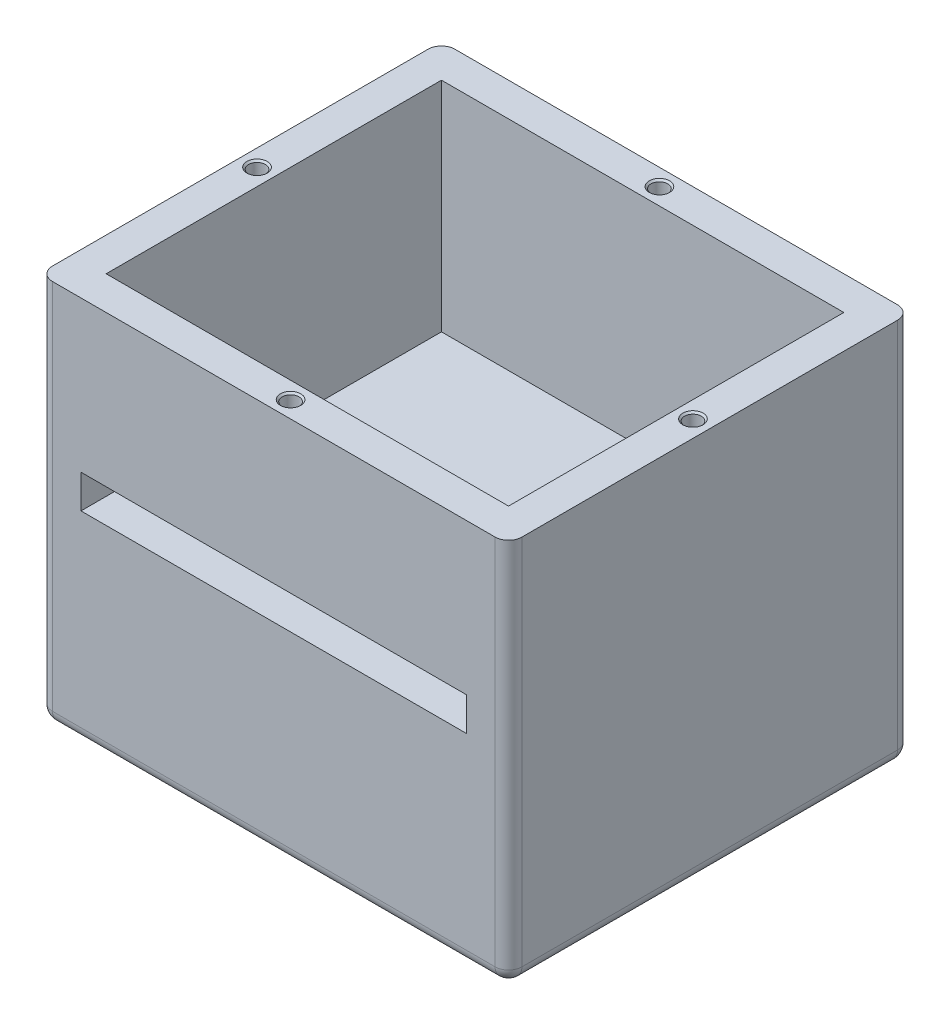
ISO-10303-21;
HEADER;
FILE_DESCRIPTION(('STEP AP214'),'2;1');
FILE_NAME('part.step','',(''),(''),'','','');
FILE_SCHEMA(('AUTOMOTIVE_DESIGN { 1 0 10303 214 1 1 1 1 }'));
ENDSEC;
DATA;
#1=APPLICATION_CONTEXT('core data for automotive mechanical design processes');
#2=APPLICATION_PROTOCOL_DEFINITION('international standard','automotive_design',2000,#1);
#3=PRODUCT_CONTEXT('',#1,'mechanical');
#4=PRODUCT('Part','Part','',(#3));
#5=PRODUCT_RELATED_PRODUCT_CATEGORY('part','',(#4));
#6=PRODUCT_DEFINITION_FORMATION('','',#4);
#7=PRODUCT_DEFINITION_CONTEXT('part definition',#1,'design');
#8=PRODUCT_DEFINITION('design','',#6,#7);
#9=PRODUCT_DEFINITION_SHAPE('','',#8);
#10=(LENGTH_UNIT() NAMED_UNIT(*) SI_UNIT(.MILLI.,.METRE.));
#11=(NAMED_UNIT(*) PLANE_ANGLE_UNIT() SI_UNIT($,.RADIAN.));
#12=(NAMED_UNIT(*) SI_UNIT($,.STERADIAN.) SOLID_ANGLE_UNIT());
#13=UNCERTAINTY_MEASURE_WITH_UNIT(LENGTH_MEASURE(1.E-05),#10,'distance_accuracy_value','');
#14=(GEOMETRIC_REPRESENTATION_CONTEXT(3) GLOBAL_UNCERTAINTY_ASSIGNED_CONTEXT((#13)) GLOBAL_UNIT_ASSIGNED_CONTEXT((#10,
#11,#12)) REPRESENTATION_CONTEXT('',''));
#15=CARTESIAN_POINT('',(0.,0.,0.));
#16=DIRECTION('',(0.,0.,1.));
#17=DIRECTION('',(1.,0.,0.));
#18=AXIS2_PLACEMENT_3D('',#15,#16,#17);
#19=CARTESIAN_POINT('',(0.,45.,0.));
#20=DIRECTION('',(0.,1.,0.));
#21=DIRECTION('',(0.,0.,1.));
#22=AXIS2_PLACEMENT_3D('',#19,#20,#21);
#23=PLANE('',#22);
#24=CARTESIAN_POINT('',(-15.,45.,0.));
#25=DIRECTION('',(0.,1.,0.));
#26=DIRECTION('',(0.,0.,1.));
#27=AXIS2_PLACEMENT_3D('',#24,#25,#26);
#28=CIRCLE('',#27,14.);
#29=CARTESIAN_POINT('',(-15.,45.,14.));
#30=VERTEX_POINT('',#29);
#31=EDGE_CURVE('E226',#30,#30,#28,.T.);
#32=ORIENTED_EDGE('',*,*,#31,.F.);
#33=EDGE_LOOP('',(#32));
#34=FACE_BOUND('',#33,.T.);
#35=CARTESIAN_POINT('',(15.,45.,0.));
#36=DIRECTION('',(0.,1.,0.));
#37=DIRECTION('',(0.,0.,-1.));
#38=AXIS2_PLACEMENT_3D('',#35,#36,#37);
#39=CIRCLE('',#38,14.);
#40=CARTESIAN_POINT('',(15.,45.,-14.));
#41=VERTEX_POINT('',#40);
#42=EDGE_CURVE('E232',#41,#41,#39,.T.);
#43=ORIENTED_EDGE('',*,*,#42,.F.);
#44=EDGE_LOOP('',(#43));
#45=FACE_BOUND('',#44,.T.);
#46=DIRECTION('',(0.,0.,1.));
#47=VECTOR('',#46,1.);
#48=CARTESIAN_POINT('',(-60.,45.,-50.));
#49=LINE('',#48,#47);
#50=CARTESIAN_POINT('',(-60.,45.,-50.));
#51=VERTEX_POINT('',#50);
#52=CARTESIAN_POINT('',(-60.,45.,50.));
#53=VERTEX_POINT('',#52);
#54=EDGE_CURVE('E275',#51,#53,#49,.T.);
#55=ORIENTED_EDGE('',*,*,#54,.T.);
#56=DIRECTION('',(1.,0.,0.));
#57=VECTOR('',#56,1.);
#58=CARTESIAN_POINT('',(-60.,45.,50.));
#59=LINE('',#58,#57);
#60=CARTESIAN_POINT('',(60.,45.,50.));
#61=VERTEX_POINT('',#60);
#62=EDGE_CURVE('E278',#53,#61,#59,.T.);
#63=ORIENTED_EDGE('',*,*,#62,.T.);
#64=DIRECTION('',(0.,0.,-1.));
#65=VECTOR('',#64,1.);
#66=CARTESIAN_POINT('',(60.,45.,-50.));
#67=LINE('',#66,#65);
#68=CARTESIAN_POINT('',(60.,45.,-50.));
#69=VERTEX_POINT('',#68);
#70=EDGE_CURVE('E282',#61,#69,#67,.T.);
#71=ORIENTED_EDGE('',*,*,#70,.T.);
#72=DIRECTION('',(-1.,0.,0.));
#73=VECTOR('',#72,1.);
#74=CARTESIAN_POINT('',(-60.,45.,-50.));
#75=LINE('',#74,#73);
#76=EDGE_CURVE('E285',#69,#51,#75,.T.);
#77=ORIENTED_EDGE('',*,*,#76,.T.);
#78=EDGE_LOOP('',(#55,#63,#71,#77));
#79=FACE_BOUND('',#78,.T.);
#80=ADVANCED_FACE('F39',(#34,#45,#79),#23,.T.);
#81=CARTESIAN_POINT('',(-70.,-5.,60.));
#82=DIRECTION('',(-1.,0.,0.));
#83=DIRECTION('',(0.,0.,1.));
#84=AXIS2_PLACEMENT_3D('',#81,#82,#83);
#85=PLANE('',#84);
#86=DIRECTION('',(0.,0.,1.));
#87=VECTOR('',#86,1.);
#88=CARTESIAN_POINT('',(-70.,110.,60.));
#89=LINE('',#88,#87);
#90=CARTESIAN_POINT('',(-70.,110.,-56.));
#91=VERTEX_POINT('',#90);
#92=CARTESIAN_POINT('',(-70.,110.,56.));
#93=VERTEX_POINT('',#92);
#94=EDGE_CURVE('E300',#91,#93,#89,.T.);
#95=ORIENTED_EDGE('',*,*,#94,.F.);
#96=DIRECTION('',(0.,1.,0.));
#97=VECTOR('',#96,1.);
#98=CARTESIAN_POINT('',(-70.,-5.,-56.));
#99=LINE('',#98,#97);
#100=CARTESIAN_POINT('',(-70.,-1.,-56.));
#101=VERTEX_POINT('',#100);
#102=EDGE_CURVE('E329',#91,#101,#99,.F.);
#103=ORIENTED_EDGE('',*,*,#102,.T.);
#104=DIRECTION('',(0.,0.,1.));
#105=VECTOR('',#104,1.);
#106=CARTESIAN_POINT('',(-70.,-1.,60.));
#107=LINE('',#106,#105);
#108=CARTESIAN_POINT('',(-70.,-1.,56.));
#109=VERTEX_POINT('',#108);
#110=EDGE_CURVE('E326',#101,#109,#107,.T.);
#111=ORIENTED_EDGE('',*,*,#110,.T.);
#112=DIRECTION('',(0.,1.,0.));
#113=VECTOR('',#112,1.);
#114=CARTESIAN_POINT('',(-70.,-5.,56.));
#115=LINE('',#114,#113);
#116=EDGE_CURVE('E318',#109,#93,#115,.T.);
#117=ORIENTED_EDGE('',*,*,#116,.T.);
#118=EDGE_LOOP('',(#95,#103,#111,#117));
#119=FACE_BOUND('',#118,.T.);
#120=ADVANCED_FACE('F430',(#119),#85,.T.);
#121=CARTESIAN_POINT('',(-70.,-5.,-60.));
#122=DIRECTION('',(0.,0.,-1.));
#123=DIRECTION('',(-1.,0.,0.));
#124=AXIS2_PLACEMENT_3D('',#121,#122,#123);
#125=PLANE('',#124);
#126=DIRECTION('',(-1.,0.,0.));
#127=VECTOR('',#126,1.);
#128=CARTESIAN_POINT('',(-70.,-1.,-60.));
#129=LINE('',#128,#127);
#130=CARTESIAN_POINT('',(66.,-1.,-60.));
#131=VERTEX_POINT('',#130);
#132=CARTESIAN_POINT('',(-66.,-1.,-60.));
#133=VERTEX_POINT('',#132);
#134=EDGE_CURVE('E342',#131,#133,#129,.T.);
#135=ORIENTED_EDGE('',*,*,#134,.T.);
#136=DIRECTION('',(0.,1.,0.));
#137=VECTOR('',#136,1.);
#138=CARTESIAN_POINT('',(-66.,-5.,-60.));
#139=LINE('',#138,#137);
#140=CARTESIAN_POINT('',(-66.,110.,-60.));
#141=VERTEX_POINT('',#140);
#142=EDGE_CURVE('E344',#133,#141,#139,.T.);
#143=ORIENTED_EDGE('',*,*,#142,.T.);
#144=DIRECTION('',(-1.,0.,0.));
#145=VECTOR('',#144,1.);
#146=CARTESIAN_POINT('',(-70.,110.,-60.));
#147=LINE('',#146,#145);
#148=CARTESIAN_POINT('',(66.,110.,-60.));
#149=VERTEX_POINT('',#148);
#150=EDGE_CURVE('E315',#149,#141,#147,.T.);
#151=ORIENTED_EDGE('',*,*,#150,.F.);
#152=DIRECTION('',(0.,1.,0.));
#153=VECTOR('',#152,1.);
#154=CARTESIAN_POINT('',(66.,-5.,-60.));
#155=LINE('',#154,#153);
#156=EDGE_CURVE('E340',#149,#131,#155,.F.);
#157=ORIENTED_EDGE('',*,*,#156,.T.);
#158=EDGE_LOOP('',(#135,#143,#151,#157));
#159=FACE_BOUND('',#158,.T.);
#160=ADVANCED_FACE('F481',(#159),#125,.T.);
#161=CARTESIAN_POINT('',(70.,-5.,60.));
#162=DIRECTION('',(1.,0.,0.));
#163=DIRECTION('',(0.,0.,-1.));
#164=AXIS2_PLACEMENT_3D('',#161,#162,#163);
#165=PLANE('',#164);
#166=DIRECTION('',(0.,0.,-1.));
#167=VECTOR('',#166,1.);
#168=CARTESIAN_POINT('',(70.,-1.,60.));
#169=LINE('',#168,#167);
#170=CARTESIAN_POINT('',(70.,-1.,56.));
#171=VERTEX_POINT('',#170);
#172=CARTESIAN_POINT('',(70.,-1.,-56.));
#173=VERTEX_POINT('',#172);
#174=EDGE_CURVE('E56',#171,#173,#169,.T.);
#175=ORIENTED_EDGE('',*,*,#174,.T.);
#176=DIRECTION('',(0.,1.,0.));
#177=VECTOR('',#176,1.);
#178=CARTESIAN_POINT('',(70.,-5.,-56.));
#179=LINE('',#178,#177);
#180=CARTESIAN_POINT('',(70.,110.,-56.));
#181=VERTEX_POINT('',#180);
#182=EDGE_CURVE('E354',#173,#181,#179,.T.);
#183=ORIENTED_EDGE('',*,*,#182,.T.);
#184=DIRECTION('',(0.,0.,-1.));
#185=VECTOR('',#184,1.);
#186=CARTESIAN_POINT('',(70.,110.,60.));
#187=LINE('',#186,#185);
#188=CARTESIAN_POINT('',(70.,110.,56.));
#189=VERTEX_POINT('',#188);
#190=EDGE_CURVE('E312',#189,#181,#187,.T.);
#191=ORIENTED_EDGE('',*,*,#190,.F.);
#192=DIRECTION('',(0.,1.,0.));
#193=VECTOR('',#192,1.);
#194=CARTESIAN_POINT('',(70.,-5.,56.));
#195=LINE('',#194,#193);
#196=EDGE_CURVE('E61',#189,#171,#195,.F.);
#197=ORIENTED_EDGE('',*,*,#196,.T.);
#198=EDGE_LOOP('',(#175,#183,#191,#197));
#199=FACE_BOUND('',#198,.T.);
#200=ADVANCED_FACE('F456',(#199),#165,.T.);
#201=CARTESIAN_POINT('',(-70.,-5.,60.));
#202=DIRECTION('',(0.,0.,1.));
#203=DIRECTION('',(1.,0.,0.));
#204=AXIS2_PLACEMENT_3D('',#201,#202,#203);
#205=PLANE('',#204);
#206=DIRECTION('',(0.,-1.,0.));
#207=VECTOR('',#206,1.);
#208=CARTESIAN_POINT('',(-57.5000000000001,65.,60.));
#209=LINE('',#208,#207);
#210=CARTESIAN_POINT('',(-57.5000000000001,65.,60.));
#211=VERTEX_POINT('',#210);
#212=CARTESIAN_POINT('',(-57.5000000000001,55.,60.));
#213=VERTEX_POINT('',#212);
#214=EDGE_CURVE('E239',#211,#213,#209,.T.);
#215=ORIENTED_EDGE('',*,*,#214,.F.);
#216=DIRECTION('',(-1.,0.,0.));
#217=VECTOR('',#216,1.);
#218=CARTESIAN_POINT('',(-57.5000000000001,65.,60.));
#219=LINE('',#218,#217);
#220=CARTESIAN_POINT('',(57.4999999999999,65.,60.));
#221=VERTEX_POINT('',#220);
#222=EDGE_CURVE('E247',#221,#211,#219,.T.);
#223=ORIENTED_EDGE('',*,*,#222,.F.);
#224=DIRECTION('',(0.,1.,0.));
#225=VECTOR('',#224,1.);
#226=CARTESIAN_POINT('',(57.4999999999999,65.,60.));
#227=LINE('',#226,#225);
#228=CARTESIAN_POINT('',(57.4999999999999,55.,60.));
#229=VERTEX_POINT('',#228);
#230=EDGE_CURVE('E261',#229,#221,#227,.T.);
#231=ORIENTED_EDGE('',*,*,#230,.F.);
#232=DIRECTION('',(1.,0.,0.));
#233=VECTOR('',#232,1.);
#234=CARTESIAN_POINT('',(-57.5000000000001,55.,60.));
#235=LINE('',#234,#233);
#236=EDGE_CURVE('E258',#213,#229,#235,.T.);
#237=ORIENTED_EDGE('',*,*,#236,.F.);
#238=EDGE_LOOP('',(#215,#223,#231,#237));
#239=FACE_BOUND('',#238,.T.);
#240=DIRECTION('',(1.,0.,0.));
#241=VECTOR('',#240,1.);
#242=CARTESIAN_POINT('',(-70.,-1.,60.));
#243=LINE('',#242,#241);
#244=CARTESIAN_POINT('',(-66.,-1.,60.));
#245=VERTEX_POINT('',#244);
#246=CARTESIAN_POINT('',(66.,-1.,60.));
#247=VERTEX_POINT('',#246);
#248=EDGE_CURVE('E348',#245,#247,#243,.T.);
#249=ORIENTED_EDGE('',*,*,#248,.T.);
#250=DIRECTION('',(0.,1.,0.));
#251=VECTOR('',#250,1.);
#252=CARTESIAN_POINT('',(66.,-5.,60.));
#253=LINE('',#252,#251);
#254=CARTESIAN_POINT('',(66.,110.,60.));
#255=VERTEX_POINT('',#254);
#256=EDGE_CURVE('E350',#247,#255,#253,.T.);
#257=ORIENTED_EDGE('',*,*,#256,.T.);
#258=DIRECTION('',(1.,0.,0.));
#259=VECTOR('',#258,1.);
#260=CARTESIAN_POINT('',(-70.,110.,60.));
#261=LINE('',#260,#259);
#262=CARTESIAN_POINT('',(-66.,110.,60.));
#263=VERTEX_POINT('',#262);
#264=EDGE_CURVE('E309',#263,#255,#261,.T.);
#265=ORIENTED_EDGE('',*,*,#264,.F.);
#266=DIRECTION('',(0.,1.,0.));
#267=VECTOR('',#266,1.);
#268=CARTESIAN_POINT('',(-66.,-5.,60.));
#269=LINE('',#268,#267);
#270=EDGE_CURVE('E346',#263,#245,#269,.F.);
#271=ORIENTED_EDGE('',*,*,#270,.T.);
#272=EDGE_LOOP('',(#249,#257,#265,#271));
#273=FACE_BOUND('',#272,.T.);
#274=ADVANCED_FACE('F441',(#239,#273),#205,.T.);
#275=CARTESIAN_POINT('',(0.,-5.,0.));
#276=DIRECTION('',(0.,-1.,0.));
#277=DIRECTION('',(0.,0.,-1.));
#278=AXIS2_PLACEMENT_3D('',#275,#276,#277);
#279=PLANE('',#278);
#280=DIRECTION('',(1.,0.,0.));
#281=VECTOR('',#280,1.);
#282=CARTESIAN_POINT('',(0.,-5.,56.));
#283=LINE('',#282,#281);
#284=CARTESIAN_POINT('',(66.,-5.,56.));
#285=VERTEX_POINT('',#284);
#286=CARTESIAN_POINT('',(-66.,-5.,56.));
#287=VERTEX_POINT('',#286);
#288=EDGE_CURVE('E333',#285,#287,#283,.F.);
#289=ORIENTED_EDGE('',*,*,#288,.T.);
#290=DIRECTION('',(0.,0.,1.));
#291=VECTOR('',#290,1.);
#292=CARTESIAN_POINT('',(-66.,-5.,0.));
#293=LINE('',#292,#291);
#294=CARTESIAN_POINT('',(-66.,-5.,-56.));
#295=VERTEX_POINT('',#294);
#296=EDGE_CURVE('E337',#287,#295,#293,.F.);
#297=ORIENTED_EDGE('',*,*,#296,.T.);
#298=DIRECTION('',(-1.,0.,0.));
#299=VECTOR('',#298,1.);
#300=CARTESIAN_POINT('',(0.,-5.,-56.));
#301=LINE('',#300,#299);
#302=CARTESIAN_POINT('',(66.,-5.,-56.));
#303=VERTEX_POINT('',#302);
#304=EDGE_CURVE('E335',#295,#303,#301,.F.);
#305=ORIENTED_EDGE('',*,*,#304,.T.);
#306=DIRECTION('',(0.,0.,-1.));
#307=VECTOR('',#306,1.);
#308=CARTESIAN_POINT('',(66.,-5.,0.));
#309=LINE('',#308,#307);
#310=EDGE_CURVE('E331',#303,#285,#309,.F.);
#311=ORIENTED_EDGE('',*,*,#310,.T.);
#312=EDGE_LOOP('',(#289,#297,#305,#311));
#313=FACE_BOUND('',#312,.T.);
#314=ADVANCED_FACE('F404',(#313),#279,.T.);
#315=CARTESIAN_POINT('',(0.,110.,0.));
#316=DIRECTION('',(0.,-1.,0.));
#317=DIRECTION('',(0.,0.,-1.));
#318=AXIS2_PLACEMENT_3D('',#315,#316,#317);
#319=PLANE('',#318);
#320=CARTESIAN_POINT('',(65.,110.,0.));
#321=DIRECTION('',(0.,1.,0.));
#322=DIRECTION('',(0.,0.,1.));
#323=AXIS2_PLACEMENT_3D('',#320,#321,#322);
#324=CIRCLE('',#323,3.025);
#325=CARTESIAN_POINT('',(65.,110.,3.025));
#326=VERTEX_POINT('',#325);
#327=EDGE_CURVE('E191',#326,#326,#324,.T.);
#328=ORIENTED_EDGE('',*,*,#327,.F.);
#329=EDGE_LOOP('',(#328));
#330=FACE_BOUND('',#329,.T.);
#331=CARTESIAN_POINT('',(0.,110.,55.));
#332=DIRECTION('',(0.,1.,0.));
#333=DIRECTION('',(0.,0.,1.));
#334=AXIS2_PLACEMENT_3D('',#331,#332,#333);
#335=CIRCLE('',#334,3.025);
#336=CARTESIAN_POINT('',(0.,110.,58.025));
#337=VERTEX_POINT('',#336);
#338=EDGE_CURVE('E184',#337,#337,#335,.T.);
#339=ORIENTED_EDGE('',*,*,#338,.F.);
#340=EDGE_LOOP('',(#339));
#341=FACE_BOUND('',#340,.T.);
#342=CARTESIAN_POINT('',(0.,110.,-55.));
#343=DIRECTION('',(0.,1.,0.));
#344=DIRECTION('',(0.,0.,1.));
#345=AXIS2_PLACEMENT_3D('',#342,#343,#344);
#346=CIRCLE('',#345,3.025);
#347=CARTESIAN_POINT('',(0.,110.,-51.975));
#348=VERTEX_POINT('',#347);
#349=EDGE_CURVE('E200',#348,#348,#346,.T.);
#350=ORIENTED_EDGE('',*,*,#349,.F.);
#351=EDGE_LOOP('',(#350));
#352=FACE_BOUND('',#351,.T.);
#353=CARTESIAN_POINT('',(-65.,110.,0.));
#354=DIRECTION('',(0.,1.,0.));
#355=DIRECTION('',(0.,0.,1.));
#356=AXIS2_PLACEMENT_3D('',#353,#354,#355);
#357=CIRCLE('',#356,3.025);
#358=CARTESIAN_POINT('',(-65.,110.,3.025));
#359=VERTEX_POINT('',#358);
#360=EDGE_CURVE('E209',#359,#359,#357,.T.);
#361=ORIENTED_EDGE('',*,*,#360,.F.);
#362=EDGE_LOOP('',(#361));
#363=FACE_BOUND('',#362,.T.);
#364=DIRECTION('',(1.,0.,0.));
#365=VECTOR('',#364,1.);
#366=CARTESIAN_POINT('',(-60.,110.,50.));
#367=LINE('',#366,#365);
#368=CARTESIAN_POINT('',(-60.,110.,50.));
#369=VERTEX_POINT('',#368);
#370=CARTESIAN_POINT('',(60.,110.,50.));
#371=VERTEX_POINT('',#370);
#372=EDGE_CURVE('E290',#369,#371,#367,.T.);
#373=ORIENTED_EDGE('',*,*,#372,.F.);
#374=DIRECTION('',(0.,0.,1.));
#375=VECTOR('',#374,1.);
#376=CARTESIAN_POINT('',(-60.,110.,-50.));
#377=LINE('',#376,#375);
#378=CARTESIAN_POINT('',(-60.,110.,-50.));
#379=VERTEX_POINT('',#378);
#380=EDGE_CURVE('E268',#379,#369,#377,.T.);
#381=ORIENTED_EDGE('',*,*,#380,.F.);
#382=DIRECTION('',(-1.,0.,0.));
#383=VECTOR('',#382,1.);
#384=CARTESIAN_POINT('',(-60.,110.,-50.));
#385=LINE('',#384,#383);
#386=CARTESIAN_POINT('',(60.,110.,-50.));
#387=VERTEX_POINT('',#386);
#388=EDGE_CURVE('E279',#387,#379,#385,.T.);
#389=ORIENTED_EDGE('',*,*,#388,.F.);
#390=DIRECTION('',(0.,0.,-1.));
#391=VECTOR('',#390,1.);
#392=CARTESIAN_POINT('',(60.,110.,-50.));
#393=LINE('',#392,#391);
#394=EDGE_CURVE('E293',#371,#387,#393,.T.);
#395=ORIENTED_EDGE('',*,*,#394,.F.);
#396=EDGE_LOOP('',(#373,#381,#389,#395));
#397=FACE_BOUND('',#396,.T.);
#398=ORIENTED_EDGE('',*,*,#150,.T.);
#399=CARTESIAN_POINT('',(-66.,110.,-56.));
#400=DIRECTION('',(0.,-1.,0.));
#401=DIRECTION('',(0.,0.,-1.));
#402=AXIS2_PLACEMENT_3D('',#399,#400,#401);
#403=CIRCLE('',#402,4.);
#404=EDGE_CURVE('E11',#141,#91,#403,.F.);
#405=ORIENTED_EDGE('',*,*,#404,.T.);
#406=ORIENTED_EDGE('',*,*,#94,.T.);
#407=CARTESIAN_POINT('',(-66.,110.,56.));
#408=DIRECTION('',(0.,-1.,0.));
#409=DIRECTION('',(0.,0.,-1.));
#410=AXIS2_PLACEMENT_3D('',#407,#408,#409);
#411=CIRCLE('',#410,4.);
#412=EDGE_CURVE('E356',#93,#263,#411,.F.);
#413=ORIENTED_EDGE('',*,*,#412,.T.);
#414=ORIENTED_EDGE('',*,*,#264,.T.);
#415=CARTESIAN_POINT('',(66.,110.,56.));
#416=DIRECTION('',(0.,-1.,0.));
#417=DIRECTION('',(0.,0.,-1.));
#418=AXIS2_PLACEMENT_3D('',#415,#416,#417);
#419=CIRCLE('',#418,4.);
#420=EDGE_CURVE('E358',#255,#189,#419,.F.);
#421=ORIENTED_EDGE('',*,*,#420,.T.);
#422=ORIENTED_EDGE('',*,*,#190,.T.);
#423=CARTESIAN_POINT('',(66.,110.,-56.));
#424=DIRECTION('',(0.,-1.,0.));
#425=DIRECTION('',(0.,0.,-1.));
#426=AXIS2_PLACEMENT_3D('',#423,#424,#425);
#427=CIRCLE('',#426,4.);
#428=EDGE_CURVE('E48',#181,#149,#427,.F.);
#429=ORIENTED_EDGE('',*,*,#428,.T.);
#430=EDGE_LOOP('',(#398,#405,#406,#413,#414,#421,#422,#429));
#431=FACE_BOUND('',#430,.T.);
#432=ADVANCED_FACE('F400',(#330,#341,#352,#363,#397,#431),#319,.F.);
#433=CARTESIAN_POINT('',(-60.,45.,-50.));
#434=DIRECTION('',(-1.,0.,0.));
#435=DIRECTION('',(0.,0.,1.));
#436=AXIS2_PLACEMENT_3D('',#433,#434,#435);
#437=PLANE('',#436);
#438=ORIENTED_EDGE('',*,*,#380,.T.);
#439=DIRECTION('',(0.,1.,0.));
#440=VECTOR('',#439,1.);
#441=CARTESIAN_POINT('',(-60.,45.,50.));
#442=LINE('',#441,#440);
#443=EDGE_CURVE('E288',#53,#369,#442,.T.);
#444=ORIENTED_EDGE('',*,*,#443,.F.);
#445=ORIENTED_EDGE('',*,*,#54,.F.);
#446=DIRECTION('',(0.,1.,0.));
#447=VECTOR('',#446,1.);
#448=CARTESIAN_POINT('',(-60.,45.,-50.));
#449=LINE('',#448,#447);
#450=EDGE_CURVE('E298',#51,#379,#449,.T.);
#451=ORIENTED_EDGE('',*,*,#450,.T.);
#452=EDGE_LOOP('',(#438,#444,#445,#451));
#453=FACE_BOUND('',#452,.T.);
#454=ADVANCED_FACE('F403',(#453),#437,.F.);
#455=CARTESIAN_POINT('',(-60.,45.,-50.));
#456=DIRECTION('',(0.,0.,-1.));
#457=DIRECTION('',(-1.,0.,0.));
#458=AXIS2_PLACEMENT_3D('',#455,#456,#457);
#459=PLANE('',#458);
#460=ORIENTED_EDGE('',*,*,#388,.T.);
#461=ORIENTED_EDGE('',*,*,#450,.F.);
#462=ORIENTED_EDGE('',*,*,#76,.F.);
#463=DIRECTION('',(0.,1.,0.));
#464=VECTOR('',#463,1.);
#465=CARTESIAN_POINT('',(60.,45.,-50.));
#466=LINE('',#465,#464);
#467=EDGE_CURVE('E301',#69,#387,#466,.T.);
#468=ORIENTED_EDGE('',*,*,#467,.T.);
#469=EDGE_LOOP('',(#460,#461,#462,#468));
#470=FACE_BOUND('',#469,.T.);
#471=ADVANCED_FACE('F489',(#470),#459,.F.);
#472=CARTESIAN_POINT('',(60.,45.,-50.));
#473=DIRECTION('',(1.,0.,0.));
#474=DIRECTION('',(0.,0.,-1.));
#475=AXIS2_PLACEMENT_3D('',#472,#473,#474);
#476=PLANE('',#475);
#477=ORIENTED_EDGE('',*,*,#394,.T.);
#478=ORIENTED_EDGE('',*,*,#467,.F.);
#479=ORIENTED_EDGE('',*,*,#70,.F.);
#480=DIRECTION('',(0.,1.,0.));
#481=VECTOR('',#480,1.);
#482=CARTESIAN_POINT('',(60.,45.,50.));
#483=LINE('',#482,#481);
#484=EDGE_CURVE('E303',#61,#371,#483,.T.);
#485=ORIENTED_EDGE('',*,*,#484,.T.);
#486=EDGE_LOOP('',(#477,#478,#479,#485));
#487=FACE_BOUND('',#486,.T.);
#488=ADVANCED_FACE('F492',(#487),#476,.F.);
#489=CARTESIAN_POINT('',(-60.,45.,50.));
#490=DIRECTION('',(0.,0.,1.));
#491=DIRECTION('',(1.,0.,0.));
#492=AXIS2_PLACEMENT_3D('',#489,#490,#491);
#493=PLANE('',#492);
#494=DIRECTION('',(-1.,0.,0.));
#495=VECTOR('',#494,1.);
#496=CARTESIAN_POINT('',(-57.5000000000001,65.,50.));
#497=LINE('',#496,#495);
#498=CARTESIAN_POINT('',(57.4999999999999,65.,50.));
#499=VERTEX_POINT('',#498);
#500=CARTESIAN_POINT('',(-57.5000000000001,65.,50.));
#501=VERTEX_POINT('',#500);
#502=EDGE_CURVE('E253',#499,#501,#497,.T.);
#503=ORIENTED_EDGE('',*,*,#502,.T.);
#504=DIRECTION('',(0.,-1.,0.));
#505=VECTOR('',#504,1.);
#506=CARTESIAN_POINT('',(-57.5000000000001,65.,50.));
#507=LINE('',#506,#505);
#508=CARTESIAN_POINT('',(-57.5000000000001,55.,50.));
#509=VERTEX_POINT('',#508);
#510=EDGE_CURVE('E243',#501,#509,#507,.T.);
#511=ORIENTED_EDGE('',*,*,#510,.T.);
#512=DIRECTION('',(1.,0.,0.));
#513=VECTOR('',#512,1.);
#514=CARTESIAN_POINT('',(-57.5000000000001,55.,50.));
#515=LINE('',#514,#513);
#516=CARTESIAN_POINT('',(57.4999999999999,55.,50.));
#517=VERTEX_POINT('',#516);
#518=EDGE_CURVE('E246',#509,#517,#515,.T.);
#519=ORIENTED_EDGE('',*,*,#518,.T.);
#520=DIRECTION('',(0.,1.,0.));
#521=VECTOR('',#520,1.);
#522=CARTESIAN_POINT('',(57.4999999999999,65.,50.));
#523=LINE('',#522,#521);
#524=EDGE_CURVE('E250',#517,#499,#523,.T.);
#525=ORIENTED_EDGE('',*,*,#524,.T.);
#526=EDGE_LOOP('',(#503,#511,#519,#525));
#527=FACE_BOUND('',#526,.T.);
#528=ORIENTED_EDGE('',*,*,#372,.T.);
#529=ORIENTED_EDGE('',*,*,#484,.F.);
#530=ORIENTED_EDGE('',*,*,#62,.F.);
#531=ORIENTED_EDGE('',*,*,#443,.T.);
#532=EDGE_LOOP('',(#528,#529,#530,#531));
#533=FACE_BOUND('',#532,.T.);
#534=ADVANCED_FACE('F496',(#527,#533),#493,.F.);
#535=CARTESIAN_POINT('',(-57.5000000000001,65.,50.));
#536=DIRECTION('',(-1.,0.,0.));
#537=DIRECTION('',(0.,0.,1.));
#538=AXIS2_PLACEMENT_3D('',#535,#536,#537);
#539=PLANE('',#538);
#540=ORIENTED_EDGE('',*,*,#214,.T.);
#541=DIRECTION('',(0.,0.,1.));
#542=VECTOR('',#541,1.);
#543=CARTESIAN_POINT('',(-57.5000000000001,55.,50.));
#544=LINE('',#543,#542);
#545=EDGE_CURVE('E256',#509,#213,#544,.T.);
#546=ORIENTED_EDGE('',*,*,#545,.F.);
#547=ORIENTED_EDGE('',*,*,#510,.F.);
#548=DIRECTION('',(0.,0.,1.));
#549=VECTOR('',#548,1.);
#550=CARTESIAN_POINT('',(-57.5000000000001,65.,50.));
#551=LINE('',#550,#549);
#552=EDGE_CURVE('E266',#501,#211,#551,.T.);
#553=ORIENTED_EDGE('',*,*,#552,.T.);
#554=EDGE_LOOP('',(#540,#546,#547,#553));
#555=FACE_BOUND('',#554,.T.);
#556=ADVANCED_FACE('F487',(#555),#539,.F.);
#557=CARTESIAN_POINT('',(-57.5000000000001,65.,50.));
#558=DIRECTION('',(0.,1.,0.));
#559=DIRECTION('',(0.,0.,1.));
#560=AXIS2_PLACEMENT_3D('',#557,#558,#559);
#561=PLANE('',#560);
#562=ORIENTED_EDGE('',*,*,#222,.T.);
#563=ORIENTED_EDGE('',*,*,#552,.F.);
#564=ORIENTED_EDGE('',*,*,#502,.F.);
#565=DIRECTION('',(0.,0.,1.));
#566=VECTOR('',#565,1.);
#567=CARTESIAN_POINT('',(57.4999999999999,65.,50.));
#568=LINE('',#567,#566);
#569=EDGE_CURVE('E269',#499,#221,#568,.T.);
#570=ORIENTED_EDGE('',*,*,#569,.T.);
#571=EDGE_LOOP('',(#562,#563,#564,#570));
#572=FACE_BOUND('',#571,.T.);
#573=ADVANCED_FACE('F816',(#572),#561,.F.);
#574=CARTESIAN_POINT('',(57.4999999999999,65.,50.));
#575=DIRECTION('',(1.,0.,0.));
#576=DIRECTION('',(0.,0.,-1.));
#577=AXIS2_PLACEMENT_3D('',#574,#575,#576);
#578=PLANE('',#577);
#579=ORIENTED_EDGE('',*,*,#230,.T.);
#580=ORIENTED_EDGE('',*,*,#569,.F.);
#581=ORIENTED_EDGE('',*,*,#524,.F.);
#582=DIRECTION('',(0.,0.,1.));
#583=VECTOR('',#582,1.);
#584=CARTESIAN_POINT('',(57.4999999999999,55.,50.));
#585=LINE('',#584,#583);
#586=EDGE_CURVE('E271',#517,#229,#585,.T.);
#587=ORIENTED_EDGE('',*,*,#586,.T.);
#588=EDGE_LOOP('',(#579,#580,#581,#587));
#589=FACE_BOUND('',#588,.T.);
#590=ADVANCED_FACE('F808',(#589),#578,.F.);
#591=CARTESIAN_POINT('',(-57.5000000000001,55.,50.));
#592=DIRECTION('',(0.,-1.,0.));
#593=DIRECTION('',(0.,0.,-1.));
#594=AXIS2_PLACEMENT_3D('',#591,#592,#593);
#595=PLANE('',#594);
#596=ORIENTED_EDGE('',*,*,#236,.T.);
#597=ORIENTED_EDGE('',*,*,#586,.F.);
#598=ORIENTED_EDGE('',*,*,#518,.F.);
#599=ORIENTED_EDGE('',*,*,#545,.T.);
#600=EDGE_LOOP('',(#596,#597,#598,#599));
#601=FACE_BOUND('',#600,.T.);
#602=ADVANCED_FACE('F772',(#601),#595,.F.);
#603=CARTESIAN_POINT('',(15.,35.,0.));
#604=DIRECTION('',(0.,-1.,0.));
#605=DIRECTION('',(0.,0.,-1.));
#606=AXIS2_PLACEMENT_3D('',#603,#604,#605);
#607=PLANE('',#606);
#608=CARTESIAN_POINT('',(15.,35.,0.));
#609=DIRECTION('',(0.,1.,0.));
#610=DIRECTION('',(0.,0.,-1.));
#611=AXIS2_PLACEMENT_3D('',#608,#609,#610);
#612=CIRCLE('',#611,14.);
#613=CARTESIAN_POINT('',(15.,35.,-14.));
#614=VERTEX_POINT('',#613);
#615=EDGE_CURVE('E229',#614,#614,#612,.T.);
#616=ORIENTED_EDGE('',*,*,#615,.T.);
#617=EDGE_LOOP('',(#616));
#618=FACE_BOUND('',#617,.T.);
#619=CARTESIAN_POINT('',(15.,35.,0.));
#620=DIRECTION('',(0.,-1.,0.));
#621=DIRECTION('',(0.,0.,-1.));
#622=AXIS2_PLACEMENT_3D('',#619,#620,#621);
#623=CIRCLE('',#622,7.5);
#624=CARTESIAN_POINT('',(15.,35.,-7.5));
#625=VERTEX_POINT('',#624);
#626=EDGE_CURVE('E225',#625,#625,#623,.F.);
#627=ORIENTED_EDGE('',*,*,#626,.F.);
#628=EDGE_LOOP('',(#627));
#629=FACE_BOUND('',#628,.T.);
#630=ADVANCED_FACE('F763',(#618,#629),#607,.F.);
#631=CARTESIAN_POINT('',(15.,35.,0.));
#632=DIRECTION('',(0.,1.,0.));
#633=DIRECTION('',(0.,0.,1.));
#634=AXIS2_PLACEMENT_3D('',#631,#632,#633);
#635=CYLINDRICAL_SURFACE('',#634,14.);
#636=ORIENTED_EDGE('',*,*,#615,.F.);
#637=EDGE_LOOP('',(#636));
#638=FACE_BOUND('',#637,.T.);
#639=ORIENTED_EDGE('',*,*,#42,.T.);
#640=EDGE_LOOP('',(#639));
#641=FACE_BOUND('',#640,.T.);
#642=ADVANCED_FACE('F754',(#638,#641),#635,.F.);
#643=CARTESIAN_POINT('',(-15.,35.,0.));
#644=DIRECTION('',(0.,1.,0.));
#645=DIRECTION('',(0.,0.,1.));
#646=AXIS2_PLACEMENT_3D('',#643,#644,#645);
#647=CYLINDRICAL_SURFACE('',#646,14.);
#648=CARTESIAN_POINT('',(-15.,35.,0.));
#649=DIRECTION('',(0.,1.,0.));
#650=DIRECTION('',(0.,0.,1.));
#651=AXIS2_PLACEMENT_3D('',#648,#649,#650);
#652=CIRCLE('',#651,14.);
#653=CARTESIAN_POINT('',(-15.,35.,14.));
#654=VERTEX_POINT('',#653);
#655=EDGE_CURVE('E222',#654,#654,#652,.T.);
#656=ORIENTED_EDGE('',*,*,#655,.F.);
#657=EDGE_LOOP('',(#656));
#658=FACE_BOUND('',#657,.T.);
#659=ORIENTED_EDGE('',*,*,#31,.T.);
#660=EDGE_LOOP('',(#659));
#661=FACE_BOUND('',#660,.T.);
#662=ADVANCED_FACE('F744',(#658,#661),#647,.F.);
#663=CARTESIAN_POINT('',(-15.,35.,0.));
#664=DIRECTION('',(0.,1.,0.));
#665=DIRECTION('',(0.,0.,1.));
#666=AXIS2_PLACEMENT_3D('',#663,#664,#665);
#667=PLANE('',#666);
#668=CARTESIAN_POINT('',(-15.,35.,0.));
#669=DIRECTION('',(0.,1.,0.));
#670=DIRECTION('',(0.,0.,1.));
#671=AXIS2_PLACEMENT_3D('',#668,#669,#670);
#672=CIRCLE('',#671,9.5);
#673=CARTESIAN_POINT('',(-15.,35.,9.5));
#674=VERTEX_POINT('',#673);
#675=EDGE_CURVE('E235',#674,#674,#672,.T.);
#676=ORIENTED_EDGE('',*,*,#675,.F.);
#677=EDGE_LOOP('',(#676));
#678=FACE_BOUND('',#677,.T.);
#679=ORIENTED_EDGE('',*,*,#655,.T.);
#680=EDGE_LOOP('',(#679));
#681=FACE_BOUND('',#680,.T.);
#682=ADVANCED_FACE('F738',(#678,#681),#667,.T.);
#683=CARTESIAN_POINT('',(15.,5.,0.));
#684=DIRECTION('',(0.,1.,0.));
#685=DIRECTION('',(0.,0.,1.));
#686=AXIS2_PLACEMENT_3D('',#683,#684,#685);
#687=PLANE('',#686);
#688=CARTESIAN_POINT('',(15.,5.,0.));
#689=DIRECTION('',(0.,1.,0.));
#690=DIRECTION('',(0.,0.,1.));
#691=AXIS2_PLACEMENT_3D('',#688,#689,#690);
#692=CIRCLE('',#691,7.5);
#693=CARTESIAN_POINT('',(15.,5.,7.5));
#694=VERTEX_POINT('',#693);
#695=EDGE_CURVE('E236',#694,#694,#692,.T.);
#696=ORIENTED_EDGE('',*,*,#695,.T.);
#697=EDGE_LOOP('',(#696));
#698=FACE_BOUND('',#697,.T.);
#699=ADVANCED_FACE('F743',(#698),#687,.T.);
#700=CARTESIAN_POINT('',(15.,5.,0.));
#701=DIRECTION('',(0.,1.,0.));
#702=DIRECTION('',(0.,0.,1.));
#703=AXIS2_PLACEMENT_3D('',#700,#701,#702);
#704=CYLINDRICAL_SURFACE('',#703,7.5);
#705=ORIENTED_EDGE('',*,*,#626,.T.);
#706=EDGE_LOOP('',(#705));
#707=FACE_BOUND('',#706,.T.);
#708=ORIENTED_EDGE('',*,*,#695,.F.);
#709=EDGE_LOOP('',(#708));
#710=FACE_BOUND('',#709,.T.);
#711=ADVANCED_FACE('F726',(#707,#710),#704,.F.);
#712=CARTESIAN_POINT('',(-15.,9.99999999999999,0.));
#713=DIRECTION('',(0.,1.,0.));
#714=DIRECTION('',(0.,0.,1.));
#715=AXIS2_PLACEMENT_3D('',#712,#713,#714);
#716=CYLINDRICAL_SURFACE('',#715,9.5);
#717=ORIENTED_EDGE('',*,*,#675,.T.);
#718=EDGE_LOOP('',(#717));
#719=FACE_BOUND('',#718,.T.);
#720=CARTESIAN_POINT('',(-15.,9.99999999999999,0.));
#721=DIRECTION('',(0.,1.,0.));
#722=DIRECTION('',(0.,0.,1.));
#723=AXIS2_PLACEMENT_3D('',#720,#721,#722);
#724=CIRCLE('',#723,9.5);
#725=CARTESIAN_POINT('',(-15.,9.99999999999999,9.5));
#726=VERTEX_POINT('',#725);
#727=EDGE_CURVE('E218',#726,#726,#724,.T.);
#728=ORIENTED_EDGE('',*,*,#727,.F.);
#729=EDGE_LOOP('',(#728));
#730=FACE_BOUND('',#729,.T.);
#731=ADVANCED_FACE('F717',(#719,#730),#716,.F.);
#732=CARTESIAN_POINT('',(-15.,9.99999999999999,0.));
#733=DIRECTION('',(0.,1.,0.));
#734=DIRECTION('',(0.,0.,1.));
#735=AXIS2_PLACEMENT_3D('',#732,#733,#734);
#736=PLANE('',#735);
#737=CARTESIAN_POINT('',(-15.,9.99999999999999,0.));
#738=DIRECTION('',(0.,1.,0.));
#739=DIRECTION('',(0.,0.,1.));
#740=AXIS2_PLACEMENT_3D('',#737,#738,#739);
#741=CIRCLE('',#740,7.5);
#742=CARTESIAN_POINT('',(-15.,9.99999999999999,7.5));
#743=VERTEX_POINT('',#742);
#744=EDGE_CURVE('E221',#743,#743,#741,.T.);
#745=ORIENTED_EDGE('',*,*,#744,.F.);
#746=EDGE_LOOP('',(#745));
#747=FACE_BOUND('',#746,.T.);
#748=ORIENTED_EDGE('',*,*,#727,.T.);
#749=EDGE_LOOP('',(#748));
#750=FACE_BOUND('',#749,.T.);
#751=ADVANCED_FACE('F710',(#747,#750),#736,.T.);
#752=CARTESIAN_POINT('',(-15.,5.,0.));
#753=DIRECTION('',(0.,-1.,0.));
#754=DIRECTION('',(0.,0.,-1.));
#755=AXIS2_PLACEMENT_3D('',#752,#753,#754);
#756=PLANE('',#755);
#757=CARTESIAN_POINT('',(-15.,5.,0.));
#758=DIRECTION('',(0.,-1.,0.));
#759=DIRECTION('',(0.,0.,-1.));
#760=AXIS2_PLACEMENT_3D('',#757,#758,#759);
#761=CIRCLE('',#760,7.5);
#762=CARTESIAN_POINT('',(-15.,5.,-7.5));
#763=VERTEX_POINT('',#762);
#764=EDGE_CURVE('E240',#763,#763,#761,.T.);
#765=ORIENTED_EDGE('',*,*,#764,.F.);
#766=EDGE_LOOP('',(#765));
#767=FACE_BOUND('',#766,.T.);
#768=ADVANCED_FACE('F716',(#767),#756,.F.);
#769=CARTESIAN_POINT('',(-15.,5.,0.));
#770=DIRECTION('',(0.,1.,0.));
#771=DIRECTION('',(0.,0.,1.));
#772=AXIS2_PLACEMENT_3D('',#769,#770,#771);
#773=CYLINDRICAL_SURFACE('',#772,7.5);
#774=ORIENTED_EDGE('',*,*,#764,.T.);
#775=EDGE_LOOP('',(#774));
#776=FACE_BOUND('',#775,.T.);
#777=ORIENTED_EDGE('',*,*,#744,.T.);
#778=EDGE_LOOP('',(#777));
#779=FACE_BOUND('',#778,.T.);
#780=ADVANCED_FACE('F705',(#776,#779),#773,.F.);
#781=CARTESIAN_POINT('',(-65.,97.,0.));
#782=DIRECTION('',(0.,1.,0.));
#783=DIRECTION('',(0.,0.,1.));
#784=AXIS2_PLACEMENT_3D('',#781,#782,#783);
#785=CONICAL_SURFACE('',#784,2.5,1.02974425867666);
#786=CARTESIAN_POINT('',(-65.,95.4978484524311,0.));
#787=VERTEX_POINT('',#786);
#788=VERTEX_LOOP('',#787);
#789=FACE_BOUND('',#788,.T.);
#790=CARTESIAN_POINT('',(-65.,97.,0.));
#791=DIRECTION('',(0.,1.,0.));
#792=DIRECTION('',(0.,0.,1.));
#793=AXIS2_PLACEMENT_3D('',#790,#791,#792);
#794=CIRCLE('',#793,2.5);
#795=CARTESIAN_POINT('',(-65.,97.,2.5));
#796=VERTEX_POINT('',#795);
#797=EDGE_CURVE('E215',#796,#796,#794,.T.);
#798=ORIENTED_EDGE('',*,*,#797,.T.);
#799=EDGE_LOOP('',(#798));
#800=FACE_BOUND('',#799,.T.);
#801=ADVANCED_FACE('F695',(#789,#800),#785,.F.);
#802=CARTESIAN_POINT('',(-65.,110.,0.));
#803=DIRECTION('',(0.,1.,0.));
#804=DIRECTION('',(0.,0.,1.));
#805=AXIS2_PLACEMENT_3D('',#802,#803,#804);
#806=CYLINDRICAL_SURFACE('',#805,2.5);
#807=ORIENTED_EDGE('',*,*,#797,.F.);
#808=EDGE_LOOP('',(#807));
#809=FACE_BOUND('',#808,.T.);
#810=CARTESIAN_POINT('',(-65.,109.475,0.));
#811=DIRECTION('',(0.,1.,0.));
#812=DIRECTION('',(0.,0.,1.));
#813=AXIS2_PLACEMENT_3D('',#810,#811,#812);
#814=CIRCLE('',#813,2.5);
#815=CARTESIAN_POINT('',(-65.,109.475,2.5));
#816=VERTEX_POINT('',#815);
#817=EDGE_CURVE('E212',#816,#816,#814,.T.);
#818=ORIENTED_EDGE('',*,*,#817,.T.);
#819=EDGE_LOOP('',(#818));
#820=FACE_BOUND('',#819,.T.);
#821=ADVANCED_FACE('F686',(#809,#820),#806,.F.);
#822=CARTESIAN_POINT('',(-65.,110.,0.));
#823=DIRECTION('',(0.,1.,0.));
#824=DIRECTION('',(0.,0.,1.));
#825=AXIS2_PLACEMENT_3D('',#822,#823,#824);
#826=CONICAL_SURFACE('',#825,3.025,0.785398163397448);
#827=ORIENTED_EDGE('',*,*,#817,.F.);
#828=EDGE_LOOP('',(#827));
#829=FACE_BOUND('',#828,.T.);
#830=ORIENTED_EDGE('',*,*,#360,.T.);
#831=EDGE_LOOP('',(#830));
#832=FACE_BOUND('',#831,.T.);
#833=ADVANCED_FACE('F677',(#829,#832),#826,.F.);
#834=CARTESIAN_POINT('',(0.,97.,-55.));
#835=DIRECTION('',(0.,1.,0.));
#836=DIRECTION('',(0.,0.,1.));
#837=AXIS2_PLACEMENT_3D('',#834,#835,#836);
#838=CONICAL_SURFACE('',#837,2.5,1.02974425867665);
#839=CARTESIAN_POINT('',(0.,95.4978484524311,-55.));
#840=VERTEX_POINT('',#839);
#841=VERTEX_LOOP('',#840);
#842=FACE_BOUND('',#841,.T.);
#843=CARTESIAN_POINT('',(0.,97.,-55.));
#844=DIRECTION('',(0.,1.,0.));
#845=DIRECTION('',(0.,0.,1.));
#846=AXIS2_PLACEMENT_3D('',#843,#844,#845);
#847=CIRCLE('',#846,2.5);
#848=CARTESIAN_POINT('',(0.,97.,-52.5));
#849=VERTEX_POINT('',#848);
#850=EDGE_CURVE('E206',#849,#849,#847,.T.);
#851=ORIENTED_EDGE('',*,*,#850,.T.);
#852=EDGE_LOOP('',(#851));
#853=FACE_BOUND('',#852,.T.);
#854=ADVANCED_FACE('F667',(#842,#853),#838,.F.);
#855=CARTESIAN_POINT('',(0.,110.,-55.));
#856=DIRECTION('',(0.,1.,0.));
#857=DIRECTION('',(0.,0.,1.));
#858=AXIS2_PLACEMENT_3D('',#855,#856,#857);
#859=CYLINDRICAL_SURFACE('',#858,2.5);
#860=ORIENTED_EDGE('',*,*,#850,.F.);
#861=EDGE_LOOP('',(#860));
#862=FACE_BOUND('',#861,.T.);
#863=CARTESIAN_POINT('',(0.,109.475,-55.));
#864=DIRECTION('',(0.,1.,0.));
#865=DIRECTION('',(0.,0.,1.));
#866=AXIS2_PLACEMENT_3D('',#863,#864,#865);
#867=CIRCLE('',#866,2.5);
#868=CARTESIAN_POINT('',(0.,109.475,-52.5));
#869=VERTEX_POINT('',#868);
#870=EDGE_CURVE('E203',#869,#869,#867,.T.);
#871=ORIENTED_EDGE('',*,*,#870,.T.);
#872=EDGE_LOOP('',(#871));
#873=FACE_BOUND('',#872,.T.);
#874=ADVANCED_FACE('F658',(#862,#873),#859,.F.);
#875=CARTESIAN_POINT('',(0.,110.,-55.));
#876=DIRECTION('',(0.,1.,0.));
#877=DIRECTION('',(0.,0.,1.));
#878=AXIS2_PLACEMENT_3D('',#875,#876,#877);
#879=CONICAL_SURFACE('',#878,3.025,0.785398163397452);
#880=ORIENTED_EDGE('',*,*,#870,.F.);
#881=EDGE_LOOP('',(#880));
#882=FACE_BOUND('',#881,.T.);
#883=ORIENTED_EDGE('',*,*,#349,.T.);
#884=EDGE_LOOP('',(#883));
#885=FACE_BOUND('',#884,.T.);
#886=ADVANCED_FACE('F649',(#882,#885),#879,.F.);
#887=CARTESIAN_POINT('',(0.,97.,55.));
#888=DIRECTION('',(0.,1.,0.));
#889=DIRECTION('',(0.,0.,1.));
#890=AXIS2_PLACEMENT_3D('',#887,#888,#889);
#891=CONICAL_SURFACE('',#890,2.5,1.02974425867665);
#892=CARTESIAN_POINT('',(0.,95.4978484524311,55.));
#893=VERTEX_POINT('',#892);
#894=VERTEX_LOOP('',#893);
#895=FACE_BOUND('',#894,.T.);
#896=CARTESIAN_POINT('',(0.,97.,55.));
#897=DIRECTION('',(0.,1.,0.));
#898=DIRECTION('',(0.,0.,1.));
#899=AXIS2_PLACEMENT_3D('',#896,#897,#898);
#900=CIRCLE('',#899,2.5);
#901=CARTESIAN_POINT('',(0.,97.,57.5));
#902=VERTEX_POINT('',#901);
#903=EDGE_CURVE('E197',#902,#902,#900,.T.);
#904=ORIENTED_EDGE('',*,*,#903,.T.);
#905=EDGE_LOOP('',(#904));
#906=FACE_BOUND('',#905,.T.);
#907=ADVANCED_FACE('F639',(#895,#906),#891,.F.);
#908=CARTESIAN_POINT('',(0.,110.,55.));
#909=DIRECTION('',(0.,1.,0.));
#910=DIRECTION('',(0.,0.,1.));
#911=AXIS2_PLACEMENT_3D('',#908,#909,#910);
#912=CYLINDRICAL_SURFACE('',#911,2.5);
#913=ORIENTED_EDGE('',*,*,#903,.F.);
#914=EDGE_LOOP('',(#913));
#915=FACE_BOUND('',#914,.T.);
#916=CARTESIAN_POINT('',(0.,109.475,55.));
#917=DIRECTION('',(0.,1.,0.));
#918=DIRECTION('',(0.,0.,1.));
#919=AXIS2_PLACEMENT_3D('',#916,#917,#918);
#920=CIRCLE('',#919,2.5);
#921=CARTESIAN_POINT('',(0.,109.475,57.5));
#922=VERTEX_POINT('',#921);
#923=EDGE_CURVE('E188',#922,#922,#920,.T.);
#924=ORIENTED_EDGE('',*,*,#923,.T.);
#925=EDGE_LOOP('',(#924));
#926=FACE_BOUND('',#925,.T.);
#927=ADVANCED_FACE('F630',(#915,#926),#912,.F.);
#928=CARTESIAN_POINT('',(0.,110.,55.));
#929=DIRECTION('',(0.,1.,0.));
#930=DIRECTION('',(0.,0.,1.));
#931=AXIS2_PLACEMENT_3D('',#928,#929,#930);
#932=CONICAL_SURFACE('',#931,3.025,0.785398163397452);
#933=ORIENTED_EDGE('',*,*,#923,.F.);
#934=EDGE_LOOP('',(#933));
#935=FACE_BOUND('',#934,.T.);
#936=ORIENTED_EDGE('',*,*,#338,.T.);
#937=EDGE_LOOP('',(#936));
#938=FACE_BOUND('',#937,.T.);
#939=ADVANCED_FACE('F178',(#935,#938),#932,.F.);
#940=CARTESIAN_POINT('',(65.,97.,0.));
#941=DIRECTION('',(0.,1.,0.));
#942=DIRECTION('',(0.,0.,1.));
#943=AXIS2_PLACEMENT_3D('',#940,#941,#942);
#944=CONICAL_SURFACE('',#943,2.5,1.02974425867666);
#945=CARTESIAN_POINT('',(65.,95.4978484524311,0.));
#946=VERTEX_POINT('',#945);
#947=VERTEX_LOOP('',#946);
#948=FACE_BOUND('',#947,.T.);
#949=CARTESIAN_POINT('',(65.,97.,0.));
#950=DIRECTION('',(0.,1.,0.));
#951=DIRECTION('',(0.,0.,1.));
#952=AXIS2_PLACEMENT_3D('',#949,#950,#951);
#953=CIRCLE('',#952,2.5);
#954=CARTESIAN_POINT('',(65.,97.,2.5));
#955=VERTEX_POINT('',#954);
#956=EDGE_CURVE('E182',#955,#955,#953,.T.);
#957=ORIENTED_EDGE('',*,*,#956,.T.);
#958=EDGE_LOOP('',(#957));
#959=FACE_BOUND('',#958,.T.);
#960=ADVANCED_FACE('F174',(#948,#959),#944,.F.);
#961=CARTESIAN_POINT('',(65.,110.,0.));
#962=DIRECTION('',(0.,1.,0.));
#963=DIRECTION('',(0.,0.,1.));
#964=AXIS2_PLACEMENT_3D('',#961,#962,#963);
#965=CYLINDRICAL_SURFACE('',#964,2.5);
#966=ORIENTED_EDGE('',*,*,#956,.F.);
#967=EDGE_LOOP('',(#966));
#968=FACE_BOUND('',#967,.T.);
#969=CARTESIAN_POINT('',(65.,109.475,0.));
#970=DIRECTION('',(0.,1.,0.));
#971=DIRECTION('',(0.,0.,1.));
#972=AXIS2_PLACEMENT_3D('',#969,#970,#971);
#973=CIRCLE('',#972,2.5);
#974=CARTESIAN_POINT('',(65.,109.475,2.5));
#975=VERTEX_POINT('',#974);
#976=EDGE_CURVE('E185',#975,#975,#973,.T.);
#977=ORIENTED_EDGE('',*,*,#976,.T.);
#978=EDGE_LOOP('',(#977));
#979=FACE_BOUND('',#978,.T.);
#980=ADVANCED_FACE('F177',(#968,#979),#965,.F.);
#981=CARTESIAN_POINT('',(65.,110.,0.));
#982=DIRECTION('',(0.,1.,0.));
#983=DIRECTION('',(0.,0.,1.));
#984=AXIS2_PLACEMENT_3D('',#981,#982,#983);
#985=CONICAL_SURFACE('',#984,3.025,0.785398163397448);
#986=ORIENTED_EDGE('',*,*,#976,.F.);
#987=EDGE_LOOP('',(#986));
#988=FACE_BOUND('',#987,.T.);
#989=ORIENTED_EDGE('',*,*,#327,.T.);
#990=EDGE_LOOP('',(#989));
#991=FACE_BOUND('',#990,.T.);
#992=ADVANCED_FACE('F398',(#988,#991),#985,.F.);
#993=CARTESIAN_POINT('',(66.,-5.,-56.));
#994=DIRECTION('',(0.,1.,0.));
#995=DIRECTION('',(0.,0.,1.));
#996=AXIS2_PLACEMENT_3D('',#993,#994,#995);
#997=CYLINDRICAL_SURFACE('',#996,4.);
#998=ORIENTED_EDGE('',*,*,#428,.F.);
#999=ORIENTED_EDGE('',*,*,#182,.F.);
#1000=CARTESIAN_POINT('',(66.,-1.,-56.));
#1001=DIRECTION('',(0.,-1.,0.));
#1002=DIRECTION('',(0.,0.,-1.));
#1003=AXIS2_PLACEMENT_3D('',#1000,#1001,#1002);
#1004=CIRCLE('',#1003,4.);
#1005=EDGE_CURVE('E388',#131,#173,#1004,.T.);
#1006=ORIENTED_EDGE('',*,*,#1005,.F.);
#1007=ORIENTED_EDGE('',*,*,#156,.F.);
#1008=EDGE_LOOP('',(#998,#999,#1006,#1007));
#1009=FACE_BOUND('',#1008,.T.);
#1010=ADVANCED_FACE('F41',(#1009),#997,.T.);
#1011=CARTESIAN_POINT('',(66.,-5.,56.));
#1012=DIRECTION('',(0.,1.,0.));
#1013=DIRECTION('',(0.,0.,1.));
#1014=AXIS2_PLACEMENT_3D('',#1011,#1012,#1013);
#1015=CYLINDRICAL_SURFACE('',#1014,4.);
#1016=ORIENTED_EDGE('',*,*,#420,.F.);
#1017=ORIENTED_EDGE('',*,*,#256,.F.);
#1018=CARTESIAN_POINT('',(66.,-1.,56.));
#1019=DIRECTION('',(0.,-1.,0.));
#1020=DIRECTION('',(0.,0.,-1.));
#1021=AXIS2_PLACEMENT_3D('',#1018,#1019,#1020);
#1022=CIRCLE('',#1021,4.);
#1023=EDGE_CURVE('E386',#171,#247,#1022,.T.);
#1024=ORIENTED_EDGE('',*,*,#1023,.F.);
#1025=ORIENTED_EDGE('',*,*,#196,.F.);
#1026=EDGE_LOOP('',(#1016,#1017,#1024,#1025));
#1027=FACE_BOUND('',#1026,.T.);
#1028=ADVANCED_FACE('F455',(#1027),#1015,.T.);
#1029=CARTESIAN_POINT('',(66.,-1.,60.));
#1030=DIRECTION('',(0.,0.,-1.));
#1031=DIRECTION('',(-1.,0.,0.));
#1032=AXIS2_PLACEMENT_3D('',#1029,#1030,#1031);
#1033=CYLINDRICAL_SURFACE('',#1032,4.);
#1034=CARTESIAN_POINT('',(66.,-1.,-56.));
#1035=DIRECTION('',(0.,0.,-1.));
#1036=DIRECTION('',(-1.,0.,0.));
#1037=AXIS2_PLACEMENT_3D('',#1034,#1035,#1036);
#1038=CIRCLE('',#1037,4.);
#1039=EDGE_CURVE('E43',#173,#303,#1038,.T.);
#1040=ORIENTED_EDGE('',*,*,#1039,.F.);
#1041=ORIENTED_EDGE('',*,*,#174,.F.);
#1042=CARTESIAN_POINT('',(66.,-1.,56.));
#1043=DIRECTION('',(0.,0.,1.));
#1044=DIRECTION('',(1.,0.,0.));
#1045=AXIS2_PLACEMENT_3D('',#1042,#1043,#1044);
#1046=CIRCLE('',#1045,4.);
#1047=EDGE_CURVE('E383',#285,#171,#1046,.T.);
#1048=ORIENTED_EDGE('',*,*,#1047,.F.);
#1049=ORIENTED_EDGE('',*,*,#310,.F.);
#1050=EDGE_LOOP('',(#1040,#1041,#1048,#1049));
#1051=FACE_BOUND('',#1050,.T.);
#1052=ADVANCED_FACE('F460',(#1051),#1033,.T.);
#1053=CARTESIAN_POINT('',(66.,-1.,-56.));
#1054=DIRECTION('',(1.,0.,0.));
#1055=DIRECTION('',(0.,0.,-1.));
#1056=AXIS2_PLACEMENT_3D('',#1053,#1054,#1055);
#1057=SPHERICAL_SURFACE('',#1056,4.);
#1058=ORIENTED_EDGE('',*,*,#1005,.T.);
#1059=ORIENTED_EDGE('',*,*,#1039,.T.);
#1060=CARTESIAN_POINT('',(66.,-1.,-56.));
#1061=DIRECTION('',(1.,0.,0.));
#1062=DIRECTION('',(0.,0.,-1.));
#1063=AXIS2_PLACEMENT_3D('',#1060,#1061,#1062);
#1064=CIRCLE('',#1063,4.);
#1065=EDGE_CURVE('E380',#131,#303,#1064,.F.);
#1066=ORIENTED_EDGE('',*,*,#1065,.F.);
#1067=EDGE_LOOP('',(#1058,#1059,#1066));
#1068=FACE_BOUND('',#1067,.T.);
#1069=ADVANCED_FACE('F466',(#1068),#1057,.T.);
#1070=CARTESIAN_POINT('',(66.,-1.,56.));
#1071=DIRECTION('',(1.,0.,0.));
#1072=DIRECTION('',(0.,0.,-1.));
#1073=AXIS2_PLACEMENT_3D('',#1070,#1071,#1072);
#1074=SPHERICAL_SURFACE('',#1073,4.);
#1075=ORIENTED_EDGE('',*,*,#1047,.T.);
#1076=ORIENTED_EDGE('',*,*,#1023,.T.);
#1077=CARTESIAN_POINT('',(66.,-1.,56.));
#1078=DIRECTION('',(1.,0.,0.));
#1079=DIRECTION('',(0.,0.,-1.));
#1080=AXIS2_PLACEMENT_3D('',#1077,#1078,#1079);
#1081=CIRCLE('',#1080,4.);
#1082=EDGE_CURVE('E377',#285,#247,#1081,.F.);
#1083=ORIENTED_EDGE('',*,*,#1082,.F.);
#1084=EDGE_LOOP('',(#1075,#1076,#1083));
#1085=FACE_BOUND('',#1084,.T.);
#1086=ADVANCED_FACE('F450',(#1085),#1074,.T.);
#1087=CARTESIAN_POINT('',(-70.,-1.,-56.));
#1088=DIRECTION('',(-1.,0.,0.));
#1089=DIRECTION('',(0.,0.,1.));
#1090=AXIS2_PLACEMENT_3D('',#1087,#1088,#1089);
#1091=CYLINDRICAL_SURFACE('',#1090,4.);
#1092=ORIENTED_EDGE('',*,*,#1065,.T.);
#1093=ORIENTED_EDGE('',*,*,#304,.F.);
#1094=CARTESIAN_POINT('',(-66.,-1.,-56.));
#1095=DIRECTION('',(-1.,0.,0.));
#1096=DIRECTION('',(0.,0.,1.));
#1097=AXIS2_PLACEMENT_3D('',#1094,#1095,#1096);
#1098=CIRCLE('',#1097,4.);
#1099=EDGE_CURVE('E374',#133,#295,#1098,.T.);
#1100=ORIENTED_EDGE('',*,*,#1099,.F.);
#1101=ORIENTED_EDGE('',*,*,#134,.F.);
#1102=EDGE_LOOP('',(#1092,#1093,#1100,#1101));
#1103=FACE_BOUND('',#1102,.T.);
#1104=ADVANCED_FACE('F464',(#1103),#1091,.T.);
#1105=CARTESIAN_POINT('',(-66.,-5.,-56.));
#1106=DIRECTION('',(0.,1.,0.));
#1107=DIRECTION('',(0.,0.,1.));
#1108=AXIS2_PLACEMENT_3D('',#1105,#1106,#1107);
#1109=CYLINDRICAL_SURFACE('',#1108,4.);
#1110=ORIENTED_EDGE('',*,*,#404,.F.);
#1111=ORIENTED_EDGE('',*,*,#142,.F.);
#1112=CARTESIAN_POINT('',(-66.,-1.,-56.));
#1113=DIRECTION('',(0.,-1.,0.));
#1114=DIRECTION('',(0.,0.,-1.));
#1115=AXIS2_PLACEMENT_3D('',#1112,#1113,#1114);
#1116=CIRCLE('',#1115,4.);
#1117=EDGE_CURVE('E371',#101,#133,#1116,.T.);
#1118=ORIENTED_EDGE('',*,*,#1117,.F.);
#1119=ORIENTED_EDGE('',*,*,#102,.F.);
#1120=EDGE_LOOP('',(#1110,#1111,#1118,#1119));
#1121=FACE_BOUND('',#1120,.T.);
#1122=ADVANCED_FACE('F425',(#1121),#1109,.T.);
#1123=CARTESIAN_POINT('',(-66.,-5.,56.));
#1124=DIRECTION('',(0.,1.,0.));
#1125=DIRECTION('',(0.,0.,1.));
#1126=AXIS2_PLACEMENT_3D('',#1123,#1124,#1125);
#1127=CYLINDRICAL_SURFACE('',#1126,4.);
#1128=ORIENTED_EDGE('',*,*,#412,.F.);
#1129=ORIENTED_EDGE('',*,*,#116,.F.);
#1130=CARTESIAN_POINT('',(-66.,-1.,56.));
#1131=DIRECTION('',(0.,-1.,0.));
#1132=DIRECTION('',(0.,0.,-1.));
#1133=AXIS2_PLACEMENT_3D('',#1130,#1131,#1132);
#1134=CIRCLE('',#1133,4.);
#1135=EDGE_CURVE('E368',#245,#109,#1134,.T.);
#1136=ORIENTED_EDGE('',*,*,#1135,.F.);
#1137=ORIENTED_EDGE('',*,*,#270,.F.);
#1138=EDGE_LOOP('',(#1128,#1129,#1136,#1137));
#1139=FACE_BOUND('',#1138,.T.);
#1140=ADVANCED_FACE('F437',(#1139),#1127,.T.);
#1141=CARTESIAN_POINT('',(-70.,-1.,56.));
#1142=DIRECTION('',(1.,0.,0.));
#1143=DIRECTION('',(0.,0.,-1.));
#1144=AXIS2_PLACEMENT_3D('',#1141,#1142,#1143);
#1145=CYLINDRICAL_SURFACE('',#1144,4.);
#1146=ORIENTED_EDGE('',*,*,#1082,.T.);
#1147=ORIENTED_EDGE('',*,*,#248,.F.);
#1148=CARTESIAN_POINT('',(-66.,-1.,56.));
#1149=DIRECTION('',(-1.,0.,0.));
#1150=DIRECTION('',(0.,0.,1.));
#1151=AXIS2_PLACEMENT_3D('',#1148,#1149,#1150);
#1152=CIRCLE('',#1151,4.);
#1153=EDGE_CURVE('E365',#287,#245,#1152,.T.);
#1154=ORIENTED_EDGE('',*,*,#1153,.F.);
#1155=ORIENTED_EDGE('',*,*,#288,.F.);
#1156=EDGE_LOOP('',(#1146,#1147,#1154,#1155));
#1157=FACE_BOUND('',#1156,.T.);
#1158=ADVANCED_FACE('F445',(#1157),#1145,.T.);
#1159=CARTESIAN_POINT('',(-66.,-1.,-56.));
#1160=DIRECTION('',(0.,0.,-1.));
#1161=DIRECTION('',(-1.,0.,0.));
#1162=AXIS2_PLACEMENT_3D('',#1159,#1160,#1161);
#1163=SPHERICAL_SURFACE('',#1162,4.);
#1164=ORIENTED_EDGE('',*,*,#1117,.T.);
#1165=ORIENTED_EDGE('',*,*,#1099,.T.);
#1166=CARTESIAN_POINT('',(-66.,-1.,-56.));
#1167=DIRECTION('',(0.,0.,-1.));
#1168=DIRECTION('',(-1.,0.,0.));
#1169=AXIS2_PLACEMENT_3D('',#1166,#1167,#1168);
#1170=CIRCLE('',#1169,4.);
#1171=EDGE_CURVE('E363',#101,#295,#1170,.F.);
#1172=ORIENTED_EDGE('',*,*,#1171,.F.);
#1173=EDGE_LOOP('',(#1164,#1165,#1172));
#1174=FACE_BOUND('',#1173,.T.);
#1175=ADVANCED_FACE('F520',(#1174),#1163,.T.);
#1176=CARTESIAN_POINT('',(-66.,-1.,56.));
#1177=DIRECTION('',(0.,0.,1.));
#1178=DIRECTION('',(1.,0.,0.));
#1179=AXIS2_PLACEMENT_3D('',#1176,#1177,#1178);
#1180=SPHERICAL_SURFACE('',#1179,4.);
#1181=ORIENTED_EDGE('',*,*,#1153,.T.);
#1182=ORIENTED_EDGE('',*,*,#1135,.T.);
#1183=CARTESIAN_POINT('',(-66.,-1.,56.));
#1184=DIRECTION('',(0.,0.,1.));
#1185=DIRECTION('',(1.,0.,0.));
#1186=AXIS2_PLACEMENT_3D('',#1183,#1184,#1185);
#1187=CIRCLE('',#1186,4.);
#1188=EDGE_CURVE('E361',#287,#109,#1187,.F.);
#1189=ORIENTED_EDGE('',*,*,#1188,.F.);
#1190=EDGE_LOOP('',(#1181,#1182,#1189));
#1191=FACE_BOUND('',#1190,.T.);
#1192=ADVANCED_FACE('F516',(#1191),#1180,.T.);
#1193=CARTESIAN_POINT('',(-66.,-1.,60.));
#1194=DIRECTION('',(0.,0.,1.));
#1195=DIRECTION('',(1.,0.,0.));
#1196=AXIS2_PLACEMENT_3D('',#1193,#1194,#1195);
#1197=CYLINDRICAL_SURFACE('',#1196,4.);
#1198=ORIENTED_EDGE('',*,*,#1171,.T.);
#1199=ORIENTED_EDGE('',*,*,#296,.F.);
#1200=ORIENTED_EDGE('',*,*,#1188,.T.);
#1201=ORIENTED_EDGE('',*,*,#110,.F.);
#1202=EDGE_LOOP('',(#1198,#1199,#1200,#1201));
#1203=FACE_BOUND('',#1202,.T.);
#1204=ADVANCED_FACE('F513',(#1203),#1197,.T.);
#1205=CLOSED_SHELL('',(#80,#120,#160,#200,#274,#314,#432,#454,#471,#488,#534,#556,#573,#590,
#602,#630,#642,#662,#682,#699,#711,#731,#751,#768,#780,#801,#821,#833,#854,#874,#886,#907,#927,
#939,#960,#980,#992,#1010,#1028,#1052,#1069,#1086,#1104,#1122,#1140,#1158,#1175,#1192,#1204));
#1206=MANIFOLD_SOLID_BREP('B2',#1205);
#1207=ADVANCED_BREP_SHAPE_REPRESENTATION('',(#18,#1206),#14);
#1208=SHAPE_DEFINITION_REPRESENTATION(#9,#1207);
ENDSEC;
END-ISO-10303-21;
